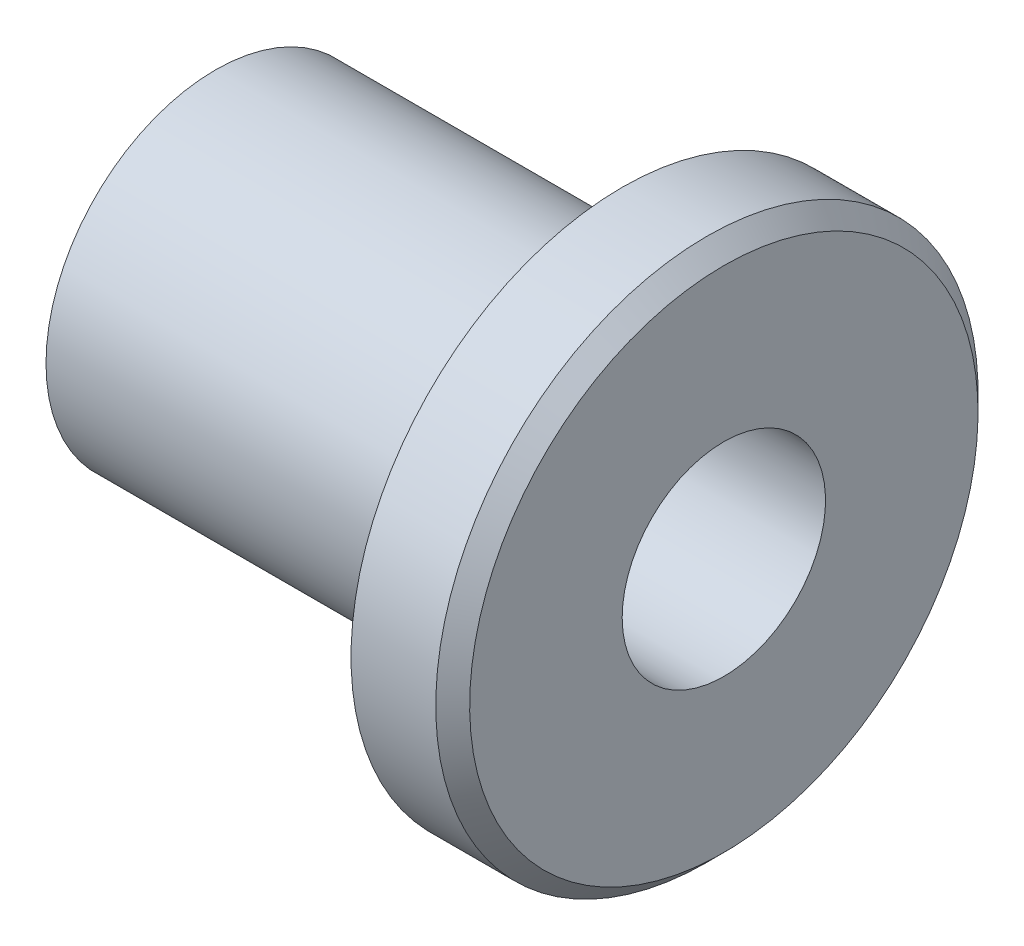
ISO-10303-21;
HEADER;
FILE_DESCRIPTION(('STEP AP214'),'2;1');
FILE_NAME('part.step','',(''),(''),'','','');
FILE_SCHEMA(('AUTOMOTIVE_DESIGN { 1 0 10303 214 1 1 1 1 }'));
ENDSEC;
DATA;
#1=APPLICATION_CONTEXT('core data for automotive mechanical design processes');
#2=APPLICATION_PROTOCOL_DEFINITION('international standard','automotive_design',2000,#1);
#3=PRODUCT_CONTEXT('',#1,'mechanical');
#4=PRODUCT('Part','Part','',(#3));
#5=PRODUCT_RELATED_PRODUCT_CATEGORY('part','',(#4));
#6=PRODUCT_DEFINITION_FORMATION('','',#4);
#7=PRODUCT_DEFINITION_CONTEXT('part definition',#1,'design');
#8=PRODUCT_DEFINITION('design','',#6,#7);
#9=PRODUCT_DEFINITION_SHAPE('','',#8);
#10=(LENGTH_UNIT() NAMED_UNIT(*) SI_UNIT(.MILLI.,.METRE.));
#11=(NAMED_UNIT(*) PLANE_ANGLE_UNIT() SI_UNIT($,.RADIAN.));
#12=(NAMED_UNIT(*) SI_UNIT($,.STERADIAN.) SOLID_ANGLE_UNIT());
#13=UNCERTAINTY_MEASURE_WITH_UNIT(LENGTH_MEASURE(1.E-05),#10,'distance_accuracy_value','');
#14=(GEOMETRIC_REPRESENTATION_CONTEXT(3) GLOBAL_UNCERTAINTY_ASSIGNED_CONTEXT((#13)) GLOBAL_UNIT_ASSIGNED_CONTEXT((#10,
#11,#12)) REPRESENTATION_CONTEXT('',''));
#15=CARTESIAN_POINT('',(0.,0.,0.));
#16=DIRECTION('',(0.,0.,1.));
#17=DIRECTION('',(1.,0.,0.));
#18=AXIS2_PLACEMENT_3D('',#15,#16,#17);
#19=CARTESIAN_POINT('',(-9.42857142857142,0.,0.));
#20=DIRECTION('',(-1.,0.,0.));
#21=DIRECTION('',(0.,-1.,0.));
#22=AXIS2_PLACEMENT_3D('',#19,#20,#21);
#23=PLANE('',#22);
#24=CARTESIAN_POINT('',(-9.42857142857142,0.,0.));
#25=DIRECTION('',(-1.,0.,0.));
#26=DIRECTION('',(0.,0.,1.));
#27=AXIS2_PLACEMENT_3D('',#24,#25,#26);
#28=CIRCLE('',#27,2.99999999999999);
#29=CARTESIAN_POINT('',(-9.42857142857142,0.,2.99999999999999));
#30=VERTEX_POINT('',#29);
#31=EDGE_CURVE('E55',#30,#30,#28,.T.);
#32=ORIENTED_EDGE('',*,*,#31,.F.);
#33=EDGE_LOOP('',(#32));
#34=FACE_BOUND('',#33,.T.);
#35=CARTESIAN_POINT('',(-9.42857142857141,0.,0.));
#36=DIRECTION('',(1.,0.,0.));
#37=DIRECTION('',(0.,1.,0.));
#38=AXIS2_PLACEMENT_3D('',#35,#36,#37);
#39=CIRCLE('',#38,5.);
#40=CARTESIAN_POINT('',(-9.42857142857141,5.,0.));
#41=VERTEX_POINT('',#40);
#42=EDGE_CURVE('E45',#41,#41,#39,.T.);
#43=ORIENTED_EDGE('',*,*,#42,.F.);
#44=EDGE_LOOP('',(#43));
#45=FACE_BOUND('',#44,.T.);
#46=ADVANCED_FACE('F33',(#34,#45),#23,.T.);
#47=CARTESIAN_POINT('',(5.57142857142858,0.,0.));
#48=DIRECTION('',(1.,0.,0.));
#49=DIRECTION('',(0.,1.,0.));
#50=AXIS2_PLACEMENT_3D('',#47,#48,#49);
#51=CYLINDRICAL_SURFACE('',#50,5.);
#52=ORIENTED_EDGE('',*,*,#42,.T.);
#53=EDGE_LOOP('',(#52));
#54=FACE_BOUND('',#53,.T.);
#55=CARTESIAN_POINT('',(2.57142857142858,0.,0.));
#56=DIRECTION('',(1.,0.,0.));
#57=DIRECTION('',(0.,1.,0.));
#58=AXIS2_PLACEMENT_3D('',#55,#56,#57);
#59=CIRCLE('',#58,5.);
#60=CARTESIAN_POINT('',(2.57142857142858,5.,0.));
#61=VERTEX_POINT('',#60);
#62=EDGE_CURVE('E49',#61,#61,#59,.T.);
#63=ORIENTED_EDGE('',*,*,#62,.F.);
#64=EDGE_LOOP('',(#63));
#65=FACE_BOUND('',#64,.T.);
#66=ADVANCED_FACE('F68',(#54,#65),#51,.T.);
#67=CARTESIAN_POINT('',(2.57142857142858,5.,0.));
#68=DIRECTION('',(-1.,0.,0.));
#69=DIRECTION('',(0.,-1.,0.));
#70=AXIS2_PLACEMENT_3D('',#67,#68,#69);
#71=PLANE('',#70);
#72=ORIENTED_EDGE('',*,*,#62,.T.);
#73=EDGE_LOOP('',(#72));
#74=FACE_BOUND('',#73,.T.);
#75=CARTESIAN_POINT('',(2.57142857142858,0.,0.));
#76=DIRECTION('',(1.,0.,0.));
#77=DIRECTION('',(0.,1.,0.));
#78=AXIS2_PLACEMENT_3D('',#75,#76,#77);
#79=CIRCLE('',#78,8.);
#80=CARTESIAN_POINT('',(2.57142857142858,8.,0.));
#81=VERTEX_POINT('',#80);
#82=EDGE_CURVE('E54',#81,#81,#79,.T.);
#83=ORIENTED_EDGE('',*,*,#82,.F.);
#84=EDGE_LOOP('',(#83));
#85=FACE_BOUND('',#84,.T.);
#86=ADVANCED_FACE('F73',(#74,#85),#71,.T.);
#87=CARTESIAN_POINT('',(5.57142857142858,0.,0.));
#88=DIRECTION('',(1.,0.,0.));
#89=DIRECTION('',(0.,1.,0.));
#90=AXIS2_PLACEMENT_3D('',#87,#88,#89);
#91=CYLINDRICAL_SURFACE('',#90,8.);
#92=CARTESIAN_POINT('',(5.07142857142858,0.,0.));
#93=DIRECTION('',(1.,0.,0.));
#94=DIRECTION('',(0.,1.,0.));
#95=AXIS2_PLACEMENT_3D('',#92,#93,#94);
#96=CIRCLE('',#95,8.);
#97=CARTESIAN_POINT('',(5.07142857142858,8.,0.));
#98=VERTEX_POINT('',#97);
#99=EDGE_CURVE('E10',#98,#98,#96,.F.);
#100=ORIENTED_EDGE('',*,*,#99,.T.);
#101=EDGE_LOOP('',(#100));
#102=FACE_BOUND('',#101,.T.);
#103=ORIENTED_EDGE('',*,*,#82,.T.);
#104=EDGE_LOOP('',(#103));
#105=FACE_BOUND('',#104,.T.);
#106=ADVANCED_FACE('F79',(#102,#105),#91,.T.);
#107=CARTESIAN_POINT('',(5.57142857142858,8.,0.));
#108=DIRECTION('',(1.,0.,0.));
#109=DIRECTION('',(0.,1.,0.));
#110=AXIS2_PLACEMENT_3D('',#107,#108,#109);
#111=PLANE('',#110);
#112=CARTESIAN_POINT('',(5.57142857142858,0.,0.));
#113=DIRECTION('',(1.,0.,0.));
#114=DIRECTION('',(0.,1.,0.));
#115=AXIS2_PLACEMENT_3D('',#112,#113,#114);
#116=CIRCLE('',#115,7.49999999999999);
#117=CARTESIAN_POINT('',(5.57142857142858,7.49999999999999,0.));
#118=VERTEX_POINT('',#117);
#119=EDGE_CURVE('E41',#118,#118,#116,.T.);
#120=ORIENTED_EDGE('',*,*,#119,.T.);
#121=EDGE_LOOP('',(#120));
#122=FACE_BOUND('',#121,.T.);
#123=CARTESIAN_POINT('',(5.57142857142858,0.,0.));
#124=DIRECTION('',(1.,0.,0.));
#125=DIRECTION('',(0.,1.,0.));
#126=AXIS2_PLACEMENT_3D('',#123,#124,#125);
#127=CIRCLE('',#126,2.99999999999999);
#128=CARTESIAN_POINT('',(5.57142857142858,2.99999999999999,0.));
#129=VERTEX_POINT('',#128);
#130=EDGE_CURVE('E52',#129,#129,#127,.T.);
#131=ORIENTED_EDGE('',*,*,#130,.F.);
#132=EDGE_LOOP('',(#131));
#133=FACE_BOUND('',#132,.T.);
#134=ADVANCED_FACE('F84',(#122,#133),#111,.T.);
#135=CARTESIAN_POINT('',(-9.42857142857142,0.,0.));
#136=DIRECTION('',(-1.,0.,0.));
#137=DIRECTION('',(0.,0.,1.));
#138=AXIS2_PLACEMENT_3D('',#135,#136,#137);
#139=CYLINDRICAL_SURFACE('',#138,2.99999999999999);
#140=ORIENTED_EDGE('',*,*,#130,.T.);
#141=EDGE_LOOP('',(#140));
#142=FACE_BOUND('',#141,.T.);
#143=ORIENTED_EDGE('',*,*,#31,.T.);
#144=EDGE_LOOP('',(#143));
#145=FACE_BOUND('',#144,.T.);
#146=ADVANCED_FACE('F64',(#142,#145),#139,.F.);
#147=CARTESIAN_POINT('',(5.57142857142858,0.,0.));
#148=DIRECTION('',(-1.,0.,0.));
#149=DIRECTION('',(0.,-1.,0.));
#150=AXIS2_PLACEMENT_3D('',#147,#148,#149);
#151=CONICAL_SURFACE('',#150,7.49999999999999,0.785398163397448);
#152=ORIENTED_EDGE('',*,*,#99,.F.);
#153=EDGE_LOOP('',(#152));
#154=FACE_BOUND('',#153,.T.);
#155=ORIENTED_EDGE('',*,*,#119,.F.);
#156=EDGE_LOOP('',(#155));
#157=FACE_BOUND('',#156,.T.);
#158=ADVANCED_FACE('F36',(#154,#157),#151,.T.);
#159=CLOSED_SHELL('',(#46,#66,#86,#106,#134,#146,#158));
#160=MANIFOLD_SOLID_BREP('B2',#159);
#161=ADVANCED_BREP_SHAPE_REPRESENTATION('',(#18,#160),#14);
#162=SHAPE_DEFINITION_REPRESENTATION(#9,#161);
ENDSEC;
END-ISO-10303-21;
